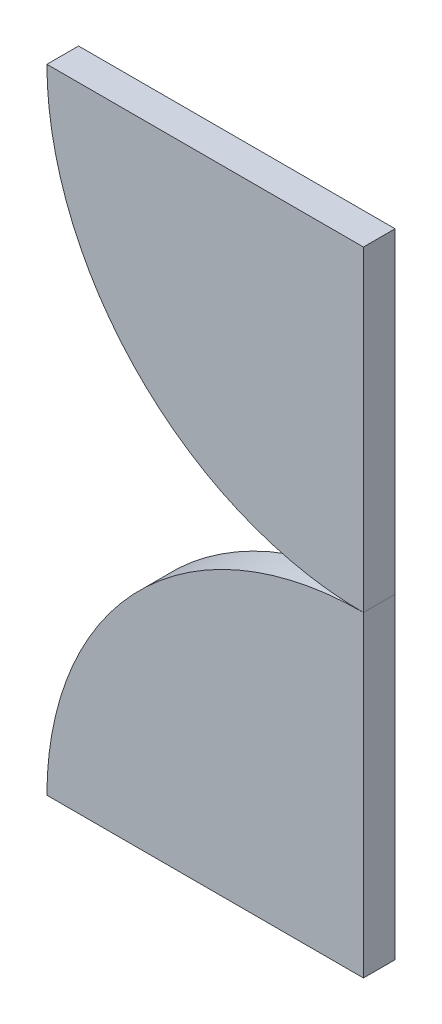
ISO-10303-21;
HEADER;
FILE_DESCRIPTION(('STEP AP214'),'2;1');
FILE_NAME('part.step','',(''),(''),'','','');
FILE_SCHEMA(('AUTOMOTIVE_DESIGN { 1 0 10303 214 1 1 1 1 }'));
ENDSEC;
DATA;
#1=APPLICATION_CONTEXT('core data for automotive mechanical design processes');
#2=APPLICATION_PROTOCOL_DEFINITION('international standard','automotive_design',2000,#1);
#3=PRODUCT_CONTEXT('',#1,'mechanical');
#4=PRODUCT('Part','Part','',(#3));
#5=PRODUCT_RELATED_PRODUCT_CATEGORY('part','',(#4));
#6=PRODUCT_DEFINITION_FORMATION('','',#4);
#7=PRODUCT_DEFINITION_CONTEXT('part definition',#1,'design');
#8=PRODUCT_DEFINITION('design','',#6,#7);
#9=PRODUCT_DEFINITION_SHAPE('','',#8);
#10=(LENGTH_UNIT() NAMED_UNIT(*) SI_UNIT(.MILLI.,.METRE.));
#11=(NAMED_UNIT(*) PLANE_ANGLE_UNIT() SI_UNIT($,.RADIAN.));
#12=(NAMED_UNIT(*) SI_UNIT($,.STERADIAN.) SOLID_ANGLE_UNIT());
#13=UNCERTAINTY_MEASURE_WITH_UNIT(LENGTH_MEASURE(1.E-05),#10,'distance_accuracy_value','');
#14=(GEOMETRIC_REPRESENTATION_CONTEXT(3) GLOBAL_UNCERTAINTY_ASSIGNED_CONTEXT((#13)) GLOBAL_UNIT_ASSIGNED_CONTEXT((#10,
#11,#12)) REPRESENTATION_CONTEXT('',''));
#15=CARTESIAN_POINT('',(0.,0.,0.));
#16=DIRECTION('',(0.,0.,1.));
#17=DIRECTION('',(1.,0.,0.));
#18=AXIS2_PLACEMENT_3D('',#15,#16,#17);
#19=CARTESIAN_POINT('',(0.,0.,1.));
#20=DIRECTION('',(1.,0.,0.));
#21=DIRECTION('',(0.,0.,-1.));
#22=AXIS2_PLACEMENT_3D('',#19,#20,#21);
#23=PLANE('',#22);
#24=DIRECTION('',(0.,-1.,0.));
#25=VECTOR('',#24,1.);
#26=CARTESIAN_POINT('',(0.,0.,0.));
#27=LINE('',#26,#25);
#28=CARTESIAN_POINT('',(0.,-10.,0.));
#29=VERTEX_POINT('',#28);
#30=CARTESIAN_POINT('',(0.,-20.,0.));
#31=VERTEX_POINT('',#30);
#32=EDGE_CURVE('E87',#29,#31,#27,.T.);
#33=ORIENTED_EDGE('',*,*,#32,.F.);
#34=DIRECTION('',(0.,0.,-1.));
#35=VECTOR('',#34,1.);
#36=CARTESIAN_POINT('',(0.,-10.,1.));
#37=LINE('',#36,#35);
#38=CARTESIAN_POINT('',(0.,-10.,1.));
#39=VERTEX_POINT('',#38);
#40=EDGE_CURVE('E12',#39,#29,#37,.T.);
#41=ORIENTED_EDGE('',*,*,#40,.F.);
#42=DIRECTION('',(0.,-1.,0.));
#43=VECTOR('',#42,1.);
#44=CARTESIAN_POINT('',(0.,0.,1.));
#45=LINE('',#44,#43);
#46=CARTESIAN_POINT('',(0.,-20.,1.));
#47=VERTEX_POINT('',#46);
#48=EDGE_CURVE('E85',#39,#47,#45,.T.);
#49=ORIENTED_EDGE('',*,*,#48,.T.);
#50=DIRECTION('',(0.,0.,-1.));
#51=VECTOR('',#50,1.);
#52=CARTESIAN_POINT('',(0.,-20.,1.));
#53=LINE('',#52,#51);
#54=EDGE_CURVE('E67',#47,#31,#53,.T.);
#55=ORIENTED_EDGE('',*,*,#54,.T.);
#56=EDGE_LOOP('',(#33,#41,#49,#55));
#57=FACE_BOUND('',#56,.T.);
#58=ADVANCED_FACE('F51',(#57),#23,.T.);
#59=CARTESIAN_POINT('',(0.,-20.,1.));
#60=DIRECTION('',(0.,0.,-1.));
#61=DIRECTION('',(-1.,0.,0.));
#62=AXIS2_PLACEMENT_3D('',#59,#60,#61);
#63=CYLINDRICAL_SURFACE('',#62,10.);
#64=CARTESIAN_POINT('',(0.,-20.,0.));
#65=DIRECTION('',(0.,0.,1.));
#66=DIRECTION('',(1.,0.,0.));
#67=AXIS2_PLACEMENT_3D('',#64,#65,#66);
#68=CIRCLE('',#67,10.);
#69=CARTESIAN_POINT('',(-10.,-20.,0.));
#70=VERTEX_POINT('',#69);
#71=EDGE_CURVE('E99',#29,#70,#68,.T.);
#72=ORIENTED_EDGE('',*,*,#71,.T.);
#73=DIRECTION('',(0.,0.,-1.));
#74=VECTOR('',#73,1.);
#75=CARTESIAN_POINT('',(-10.,-20.,1.));
#76=LINE('',#75,#74);
#77=CARTESIAN_POINT('',(-10.,-20.,1.));
#78=VERTEX_POINT('',#77);
#79=EDGE_CURVE('E59',#78,#70,#76,.T.);
#80=ORIENTED_EDGE('',*,*,#79,.F.);
#81=CARTESIAN_POINT('',(0.,-20.,1.));
#82=DIRECTION('',(0.,0.,1.));
#83=DIRECTION('',(1.,0.,0.));
#84=AXIS2_PLACEMENT_3D('',#81,#82,#83);
#85=CIRCLE('',#84,10.);
#86=EDGE_CURVE('E90',#39,#78,#85,.T.);
#87=ORIENTED_EDGE('',*,*,#86,.F.);
#88=ORIENTED_EDGE('',*,*,#40,.T.);
#89=EDGE_LOOP('',(#72,#80,#87,#88));
#90=FACE_BOUND('',#89,.T.);
#91=ADVANCED_FACE('F91',(#90),#63,.T.);
#92=CARTESIAN_POINT('',(0.,-20.,1.));
#93=DIRECTION('',(0.,-1.,0.));
#94=DIRECTION('',(0.,0.,-1.));
#95=AXIS2_PLACEMENT_3D('',#92,#93,#94);
#96=PLANE('',#95);
#97=DIRECTION('',(-1.,0.,0.));
#98=VECTOR('',#97,1.);
#99=CARTESIAN_POINT('',(0.,-20.,0.));
#100=LINE('',#99,#98);
#101=EDGE_CURVE('E96',#31,#70,#100,.T.);
#102=ORIENTED_EDGE('',*,*,#101,.F.);
#103=ORIENTED_EDGE('',*,*,#54,.F.);
#104=DIRECTION('',(-1.,0.,0.));
#105=VECTOR('',#104,1.);
#106=CARTESIAN_POINT('',(0.,-20.,1.));
#107=LINE('',#106,#105);
#108=EDGE_CURVE('E93',#47,#78,#107,.T.);
#109=ORIENTED_EDGE('',*,*,#108,.T.);
#110=ORIENTED_EDGE('',*,*,#79,.T.);
#111=EDGE_LOOP('',(#102,#103,#109,#110));
#112=FACE_BOUND('',#111,.T.);
#113=ADVANCED_FACE('F107',(#112),#96,.T.);
#114=CARTESIAN_POINT('',(0.,0.,1.));
#115=DIRECTION('',(0.,0.,1.));
#116=DIRECTION('',(1.,0.,0.));
#117=AXIS2_PLACEMENT_3D('',#114,#115,#116);
#118=PLANE('',#117);
#119=ORIENTED_EDGE('',*,*,#48,.F.);
#120=ORIENTED_EDGE('',*,*,#86,.T.);
#121=ORIENTED_EDGE('',*,*,#108,.F.);
#122=EDGE_LOOP('',(#119,#120,#121));
#123=FACE_BOUND('',#122,.T.);
#124=ADVANCED_FACE('F95',(#123),#118,.T.);
#125=CARTESIAN_POINT('',(0.,0.,0.));
#126=DIRECTION('',(0.,0.,1.));
#127=DIRECTION('',(1.,0.,0.));
#128=AXIS2_PLACEMENT_3D('',#125,#126,#127);
#129=PLANE('',#128);
#130=ORIENTED_EDGE('',*,*,#32,.T.);
#131=ORIENTED_EDGE('',*,*,#101,.T.);
#132=ORIENTED_EDGE('',*,*,#71,.F.);
#133=EDGE_LOOP('',(#130,#131,#132));
#134=FACE_BOUND('',#133,.T.);
#135=ADVANCED_FACE('F106',(#134),#129,.F.);
#136=CLOSED_SHELL('',(#58,#91,#113,#124,#135));
#137=MANIFOLD_SOLID_BREP('B2',#136);
#138=CARTESIAN_POINT('',(0.,0.,1.));
#139=DIRECTION('',(0.,0.,-1.));
#140=DIRECTION('',(-1.,0.,0.));
#141=AXIS2_PLACEMENT_3D('',#138,#139,#140);
#142=CYLINDRICAL_SURFACE('',#141,10.);
#143=CARTESIAN_POINT('',(0.,0.,0.));
#144=DIRECTION('',(0.,0.,1.));
#145=DIRECTION('',(1.,0.,0.));
#146=AXIS2_PLACEMENT_3D('',#143,#144,#145);
#147=CIRCLE('',#146,10.);
#148=CARTESIAN_POINT('',(0.,-10.,0.));
#149=VERTEX_POINT('',#148);
#150=CARTESIAN_POINT('',(-10.,0.,0.));
#151=VERTEX_POINT('',#150);
#152=EDGE_CURVE('E190',#149,#151,#147,.F.);
#153=ORIENTED_EDGE('',*,*,#152,.F.);
#154=DIRECTION('',(0.,0.,-1.));
#155=VECTOR('',#154,1.);
#156=CARTESIAN_POINT('',(0.,-10.,1.));
#157=LINE('',#156,#155);
#158=CARTESIAN_POINT('',(0.,-10.,1.));
#159=VERTEX_POINT('',#158);
#160=EDGE_CURVE('E49',#159,#149,#157,.T.);
#161=ORIENTED_EDGE('',*,*,#160,.F.);
#162=CARTESIAN_POINT('',(0.,0.,1.));
#163=DIRECTION('',(0.,0.,1.));
#164=DIRECTION('',(1.,0.,0.));
#165=AXIS2_PLACEMENT_3D('',#162,#163,#164);
#166=CIRCLE('',#165,10.);
#167=CARTESIAN_POINT('',(-10.,0.,1.));
#168=VERTEX_POINT('',#167);
#169=EDGE_CURVE('E188',#159,#168,#166,.F.);
#170=ORIENTED_EDGE('',*,*,#169,.T.);
#171=DIRECTION('',(0.,0.,-1.));
#172=VECTOR('',#171,1.);
#173=CARTESIAN_POINT('',(-10.,0.,1.));
#174=LINE('',#173,#172);
#175=EDGE_CURVE('E186',#168,#151,#174,.T.);
#176=ORIENTED_EDGE('',*,*,#175,.T.);
#177=EDGE_LOOP('',(#153,#161,#170,#176));
#178=FACE_BOUND('',#177,.T.);
#179=ADVANCED_FACE('F153',(#178),#142,.T.);
#180=CARTESIAN_POINT('',(0.,0.,1.));
#181=DIRECTION('',(1.,0.,0.));
#182=DIRECTION('',(0.,0.,-1.));
#183=AXIS2_PLACEMENT_3D('',#180,#181,#182);
#184=PLANE('',#183);
#185=DIRECTION('',(0.,-1.,0.));
#186=VECTOR('',#185,1.);
#187=CARTESIAN_POINT('',(0.,0.,0.));
#188=LINE('',#187,#186);
#189=CARTESIAN_POINT('',(0.,0.,0.));
#190=VERTEX_POINT('',#189);
#191=EDGE_CURVE('E204',#190,#149,#188,.T.);
#192=ORIENTED_EDGE('',*,*,#191,.F.);
#193=DIRECTION('',(0.,0.,-1.));
#194=VECTOR('',#193,1.);
#195=CARTESIAN_POINT('',(0.,0.,1.));
#196=LINE('',#195,#194);
#197=CARTESIAN_POINT('',(0.,0.,1.));
#198=VERTEX_POINT('',#197);
#199=EDGE_CURVE('E161',#198,#190,#196,.T.);
#200=ORIENTED_EDGE('',*,*,#199,.F.);
#201=DIRECTION('',(0.,-1.,0.));
#202=VECTOR('',#201,1.);
#203=CARTESIAN_POINT('',(0.,0.,1.));
#204=LINE('',#203,#202);
#205=EDGE_CURVE('E196',#198,#159,#204,.T.);
#206=ORIENTED_EDGE('',*,*,#205,.T.);
#207=ORIENTED_EDGE('',*,*,#160,.T.);
#208=EDGE_LOOP('',(#192,#200,#206,#207));
#209=FACE_BOUND('',#208,.T.);
#210=ADVANCED_FACE('F199',(#209),#184,.T.);
#211=CARTESIAN_POINT('',(0.,0.,1.));
#212=DIRECTION('',(0.,-1.,0.));
#213=DIRECTION('',(0.,0.,-1.));
#214=AXIS2_PLACEMENT_3D('',#211,#212,#213);
#215=PLANE('',#214);
#216=DIRECTION('',(-1.,0.,0.));
#217=VECTOR('',#216,1.);
#218=CARTESIAN_POINT('',(0.,0.,0.));
#219=LINE('',#218,#217);
#220=EDGE_CURVE('E197',#190,#151,#219,.T.);
#221=ORIENTED_EDGE('',*,*,#220,.T.);
#222=ORIENTED_EDGE('',*,*,#175,.F.);
#223=DIRECTION('',(-1.,0.,0.));
#224=VECTOR('',#223,1.);
#225=CARTESIAN_POINT('',(0.,0.,1.));
#226=LINE('',#225,#224);
#227=EDGE_CURVE('E169',#198,#168,#226,.T.);
#228=ORIENTED_EDGE('',*,*,#227,.F.);
#229=ORIENTED_EDGE('',*,*,#199,.T.);
#230=EDGE_LOOP('',(#221,#222,#228,#229));
#231=FACE_BOUND('',#230,.T.);
#232=ADVANCED_FACE('F207',(#231),#215,.F.);
#233=CARTESIAN_POINT('',(0.,0.,1.));
#234=DIRECTION('',(0.,0.,1.));
#235=DIRECTION('',(1.,0.,0.));
#236=AXIS2_PLACEMENT_3D('',#233,#234,#235);
#237=PLANE('',#236);
#238=ORIENTED_EDGE('',*,*,#169,.F.);
#239=ORIENTED_EDGE('',*,*,#205,.F.);
#240=ORIENTED_EDGE('',*,*,#227,.T.);
#241=EDGE_LOOP('',(#238,#239,#240));
#242=FACE_BOUND('',#241,.T.);
#243=ADVANCED_FACE('F195',(#242),#237,.T.);
#244=CARTESIAN_POINT('',(0.,0.,0.));
#245=DIRECTION('',(0.,0.,1.));
#246=DIRECTION('',(1.,0.,0.));
#247=AXIS2_PLACEMENT_3D('',#244,#245,#246);
#248=PLANE('',#247);
#249=ORIENTED_EDGE('',*,*,#152,.T.);
#250=ORIENTED_EDGE('',*,*,#220,.F.);
#251=ORIENTED_EDGE('',*,*,#191,.T.);
#252=EDGE_LOOP('',(#249,#250,#251));
#253=FACE_BOUND('',#252,.T.);
#254=ADVANCED_FACE('F209',(#253),#248,.F.);
#255=CLOSED_SHELL('',(#179,#210,#232,#243,#254));
#256=MANIFOLD_SOLID_BREP('B6',#255);
#257=ADVANCED_BREP_SHAPE_REPRESENTATION('',(#18,#137,#256),#14);
#258=SHAPE_DEFINITION_REPRESENTATION(#9,#257);
ENDSEC;
END-ISO-10303-21;
